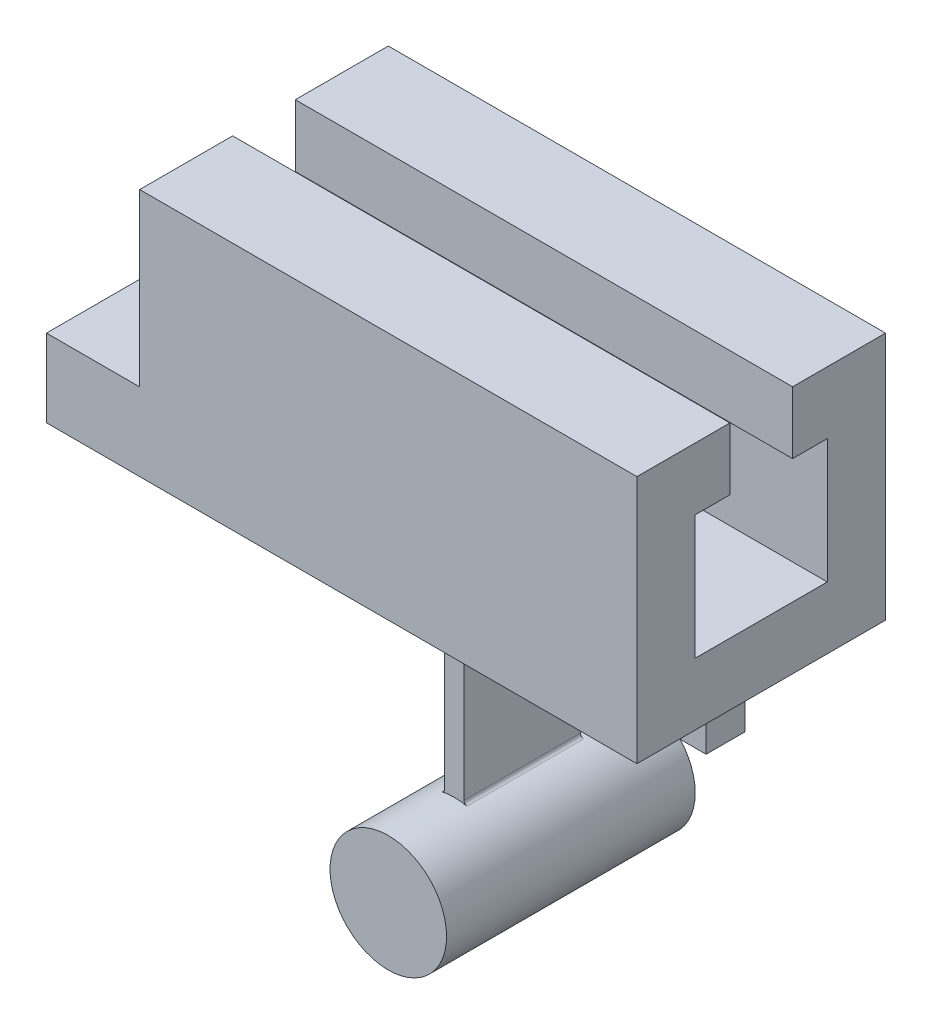
ISO-10303-21;
HEADER;
FILE_DESCRIPTION(('STEP AP214'),'2;1');
FILE_NAME('part.step','',(''),(''),'','','');
FILE_SCHEMA(('AUTOMOTIVE_DESIGN { 1 0 10303 214 1 1 1 1 }'));
ENDSEC;
DATA;
#1=APPLICATION_CONTEXT('core data for automotive mechanical design processes');
#2=APPLICATION_PROTOCOL_DEFINITION('international standard','automotive_design',2000,#1);
#3=PRODUCT_CONTEXT('',#1,'mechanical');
#4=PRODUCT('Part','Part','',(#3));
#5=PRODUCT_RELATED_PRODUCT_CATEGORY('part','',(#4));
#6=PRODUCT_DEFINITION_FORMATION('','',#4);
#7=PRODUCT_DEFINITION_CONTEXT('part definition',#1,'design');
#8=PRODUCT_DEFINITION('design','',#6,#7);
#9=PRODUCT_DEFINITION_SHAPE('','',#8);
#10=(LENGTH_UNIT() NAMED_UNIT(*) SI_UNIT(.MILLI.,.METRE.));
#11=(NAMED_UNIT(*) PLANE_ANGLE_UNIT() SI_UNIT($,.RADIAN.));
#12=(NAMED_UNIT(*) SI_UNIT($,.STERADIAN.) SOLID_ANGLE_UNIT());
#13=UNCERTAINTY_MEASURE_WITH_UNIT(LENGTH_MEASURE(1.E-05),#10,'distance_accuracy_value','');
#14=(GEOMETRIC_REPRESENTATION_CONTEXT(3) GLOBAL_UNCERTAINTY_ASSIGNED_CONTEXT((#13)) GLOBAL_UNIT_ASSIGNED_CONTEXT((#10,
#11,#12)) REPRESENTATION_CONTEXT('',''));
#15=CARTESIAN_POINT('',(0.,0.,0.));
#16=DIRECTION('',(0.,0.,1.));
#17=DIRECTION('',(1.,0.,0.));
#18=AXIS2_PLACEMENT_3D('',#15,#16,#17);
#19=CARTESIAN_POINT('',(50.8,-25.4,25.4));
#20=DIRECTION('',(0.,1.,0.));
#21=DIRECTION('',(0.,0.,1.));
#22=AXIS2_PLACEMENT_3D('',#19,#20,#21);
#23=PLANE('',#22);
#24=DIRECTION('',(0.,0.,1.));
#25=VECTOR('',#24,1.);
#26=CARTESIAN_POINT('',(1.984375,-25.4,11.90625));
#27=LINE('',#26,#25);
#28=CARTESIAN_POINT('',(1.984375,-25.4,-11.90625));
#29=VERTEX_POINT('',#28);
#30=CARTESIAN_POINT('',(1.984375,-25.4,11.90625));
#31=VERTEX_POINT('',#30);
#32=EDGE_CURVE('E468',#29,#31,#27,.T.);
#33=ORIENTED_EDGE('',*,*,#32,.F.);
#34=DIRECTION('',(1.,0.,0.));
#35=VECTOR('',#34,1.);
#36=CARTESIAN_POINT('',(-1.984375,-25.4,-11.90625));
#37=LINE('',#36,#35);
#38=CARTESIAN_POINT('',(-1.984375,-25.4,-11.90625));
#39=VERTEX_POINT('',#38);
#40=EDGE_CURVE('E458',#39,#29,#37,.T.);
#41=ORIENTED_EDGE('',*,*,#40,.F.);
#42=DIRECTION('',(0.,0.,-1.));
#43=VECTOR('',#42,1.);
#44=CARTESIAN_POINT('',(-1.984375,-25.4,11.90625));
#45=LINE('',#44,#43);
#46=CARTESIAN_POINT('',(-1.984375,-25.4,11.90625));
#47=VERTEX_POINT('',#46);
#48=EDGE_CURVE('E465',#47,#39,#45,.T.);
#49=ORIENTED_EDGE('',*,*,#48,.F.);
#50=DIRECTION('',(-1.,0.,0.));
#51=VECTOR('',#50,1.);
#52=CARTESIAN_POINT('',(-1.984375,-25.4,11.90625));
#53=LINE('',#52,#51);
#54=EDGE_CURVE('E467',#31,#47,#53,.T.);
#55=ORIENTED_EDGE('',*,*,#54,.F.);
#56=EDGE_LOOP('',(#33,#41,#49,#55));
#57=FACE_BOUND('',#56,.T.);
#58=DIRECTION('',(-1.,0.,0.));
#59=VECTOR('',#58,1.);
#60=CARTESIAN_POINT('',(50.8,-25.4,25.4));
#61=LINE('',#60,#59);
#62=CARTESIAN_POINT('',(50.8,-25.4,25.4));
#63=VERTEX_POINT('',#62);
#64=CARTESIAN_POINT('',(-69.85,-25.4,25.4));
#65=VERTEX_POINT('',#64);
#66=EDGE_CURVE('E352',#63,#65,#61,.T.);
#67=ORIENTED_EDGE('',*,*,#66,.T.);
#68=DIRECTION('',(0.,0.,1.));
#69=VECTOR('',#68,1.);
#70=CARTESIAN_POINT('',(-69.85,-25.4,-25.4));
#71=LINE('',#70,#69);
#72=CARTESIAN_POINT('',(-69.85,-25.4,-25.4));
#73=VERTEX_POINT('',#72);
#74=EDGE_CURVE('E269',#73,#65,#71,.T.);
#75=ORIENTED_EDGE('',*,*,#74,.F.);
#76=DIRECTION('',(-1.,0.,0.));
#77=VECTOR('',#76,1.);
#78=CARTESIAN_POINT('',(50.8,-25.4,-25.4));
#79=LINE('',#78,#77);
#80=CARTESIAN_POINT('',(50.8,-25.4,-25.4));
#81=VERTEX_POINT('',#80);
#82=EDGE_CURVE('E345',#81,#73,#79,.T.);
#83=ORIENTED_EDGE('',*,*,#82,.F.);
#84=DIRECTION('',(0.,0.,-1.));
#85=VECTOR('',#84,1.);
#86=CARTESIAN_POINT('',(50.8,-25.4,25.4));
#87=LINE('',#86,#85);
#88=EDGE_CURVE('E339',#63,#81,#87,.T.);
#89=ORIENTED_EDGE('',*,*,#88,.F.);
#90=EDGE_LOOP('',(#67,#75,#83,#89));
#91=FACE_BOUND('',#90,.T.);
#92=DIRECTION('',(0.,0.,1.));
#93=VECTOR('',#92,1.);
#94=CARTESIAN_POINT('',(43.49877,-25.4,3.96874999999999));
#95=LINE('',#94,#93);
#96=CARTESIAN_POINT('',(43.49877,-25.4,-3.96875000000001));
#97=VERTEX_POINT('',#96);
#98=CARTESIAN_POINT('',(43.49877,-25.4,3.96875));
#99=VERTEX_POINT('',#98);
#100=EDGE_CURVE('E252',#97,#99,#95,.T.);
#101=ORIENTED_EDGE('',*,*,#100,.F.);
#102=DIRECTION('',(1.,0.,0.));
#103=VECTOR('',#102,1.);
#104=CARTESIAN_POINT('',(35.56127,-25.4,-3.96875000000001));
#105=LINE('',#104,#103);
#106=CARTESIAN_POINT('',(35.56127,-25.4,-3.96875));
#107=VERTEX_POINT('',#106);
#108=EDGE_CURVE('E247',#107,#97,#105,.T.);
#109=ORIENTED_EDGE('',*,*,#108,.F.);
#110=DIRECTION('',(0.,0.,-1.));
#111=VECTOR('',#110,1.);
#112=CARTESIAN_POINT('',(35.56127,-25.4,3.96874999999999));
#113=LINE('',#112,#111);
#114=CARTESIAN_POINT('',(35.56127,-25.4,3.96874999999999));
#115=VERTEX_POINT('',#114);
#116=EDGE_CURVE('E875',#115,#107,#113,.T.);
#117=ORIENTED_EDGE('',*,*,#116,.F.);
#118=DIRECTION('',(-1.,0.,0.));
#119=VECTOR('',#118,1.);
#120=CARTESIAN_POINT('',(35.56127,-25.4,3.96874999999999));
#121=LINE('',#120,#119);
#122=EDGE_CURVE('E885',#99,#115,#121,.T.);
#123=ORIENTED_EDGE('',*,*,#122,.F.);
#124=EDGE_LOOP('',(#101,#109,#117,#123));
#125=FACE_BOUND('',#124,.T.);
#126=ADVANCED_FACE('F55',(#57,#91,#125),#23,.F.);
#127=CARTESIAN_POINT('',(-50.8,0.,0.));
#128=DIRECTION('',(-1.,0.,0.));
#129=DIRECTION('',(0.,0.,1.));
#130=AXIS2_PLACEMENT_3D('',#127,#128,#129);
#131=PLANE('',#130);
#132=DIRECTION('',(0.,0.,-1.));
#133=VECTOR('',#132,1.);
#134=CARTESIAN_POINT('',(-50.8,-9.525,-25.4));
#135=LINE('',#134,#133);
#136=CARTESIAN_POINT('',(-50.8,-9.525,25.4));
#137=VERTEX_POINT('',#136);
#138=CARTESIAN_POINT('',(-50.8,-9.52499999999999,13.49375));
#139=VERTEX_POINT('',#138);
#140=EDGE_CURVE('E257',#137,#139,#135,.T.);
#141=ORIENTED_EDGE('',*,*,#140,.F.);
#142=DIRECTION('',(0.,-1.,0.));
#143=VECTOR('',#142,1.);
#144=CARTESIAN_POINT('',(-50.8,-25.4,25.4));
#145=LINE('',#144,#143);
#146=CARTESIAN_POINT('',(-50.8,25.4,25.4));
#147=VERTEX_POINT('',#146);
#148=EDGE_CURVE('E333',#147,#137,#145,.T.);
#149=ORIENTED_EDGE('',*,*,#148,.F.);
#150=DIRECTION('',(0.,0.,1.));
#151=VECTOR('',#150,1.);
#152=CARTESIAN_POINT('',(-50.8,25.4,25.4));
#153=LINE('',#152,#151);
#154=CARTESIAN_POINT('',(-50.8,25.4,6.4008));
#155=VERTEX_POINT('',#154);
#156=EDGE_CURVE('E344',#155,#147,#153,.T.);
#157=ORIENTED_EDGE('',*,*,#156,.F.);
#158=DIRECTION('',(0.,-1.,0.));
#159=VECTOR('',#158,1.);
#160=CARTESIAN_POINT('',(-50.8,25.4,6.4008));
#161=LINE('',#160,#159);
#162=CARTESIAN_POINT('',(-50.8,12.68476,6.4008));
#163=VERTEX_POINT('',#162);
#164=EDGE_CURVE('E300',#155,#163,#161,.T.);
#165=ORIENTED_EDGE('',*,*,#164,.T.);
#166=DIRECTION('',(0.,0.,-1.));
#167=VECTOR('',#166,1.);
#168=CARTESIAN_POINT('',(-50.8,12.68476,13.49375));
#169=LINE('',#168,#167);
#170=CARTESIAN_POINT('',(-50.8,12.68476,13.49375));
#171=VERTEX_POINT('',#170);
#172=EDGE_CURVE('E416',#171,#163,#169,.T.);
#173=ORIENTED_EDGE('',*,*,#172,.F.);
#174=DIRECTION('',(0.,-1.,0.));
#175=VECTOR('',#174,1.);
#176=CARTESIAN_POINT('',(-50.8,12.68476,13.49375));
#177=LINE('',#176,#175);
#178=EDGE_CURVE('E293',#171,#139,#177,.T.);
#179=ORIENTED_EDGE('',*,*,#178,.T.);
#180=EDGE_LOOP('',(#141,#149,#157,#165,#173,#179));
#181=FACE_BOUND('',#180,.T.);
#182=ADVANCED_FACE('F499',(#181),#131,.T.);
#183=CARTESIAN_POINT('',(1.984375,-75.40625,11.90625));
#184=DIRECTION('',(-1.,0.,0.));
#185=DIRECTION('',(0.,0.,1.));
#186=AXIS2_PLACEMENT_3D('',#183,#184,#185);
#187=PLANE('',#186);
#188=DIRECTION('',(0.,1.,0.));
#189=VECTOR('',#188,1.);
#190=CARTESIAN_POINT('',(1.984375,-75.40625,11.90625));
#191=LINE('',#190,#189);
#192=CARTESIAN_POINT('',(1.984375,-63.0392785671117,11.90625));
#193=VERTEX_POINT('',#192);
#194=EDGE_CURVE('E310',#193,#31,#191,.T.);
#195=ORIENTED_EDGE('',*,*,#194,.F.);
#196=DIRECTION('',(0.,0.,1.));
#197=VECTOR('',#196,1.);
#198=CARTESIAN_POINT('',(1.984375,-63.0392785671117,-11.90625));
#199=LINE('',#198,#197);
#200=CARTESIAN_POINT('',(1.984375,-63.0392785671117,-11.90625));
#201=VERTEX_POINT('',#200);
#202=EDGE_CURVE('E389',#193,#201,#199,.F.);
#203=ORIENTED_EDGE('',*,*,#202,.T.);
#204=DIRECTION('',(0.,1.,0.));
#205=VECTOR('',#204,1.);
#206=CARTESIAN_POINT('',(1.984375,-75.40625,-11.90625));
#207=LINE('',#206,#205);
#208=EDGE_CURVE('E454',#201,#29,#207,.T.);
#209=ORIENTED_EDGE('',*,*,#208,.T.);
#210=ORIENTED_EDGE('',*,*,#32,.T.);
#211=EDGE_LOOP('',(#195,#203,#209,#210));
#212=FACE_BOUND('',#211,.T.);
#213=ADVANCED_FACE('F586',(#212),#187,.F.);
#214=CARTESIAN_POINT('',(-1.984375,-75.40625,11.90625));
#215=DIRECTION('',(1.,0.,0.));
#216=DIRECTION('',(0.,0.,-1.));
#217=AXIS2_PLACEMENT_3D('',#214,#215,#216);
#218=PLANE('',#217);
#219=DIRECTION('',(0.,1.,0.));
#220=VECTOR('',#219,1.);
#221=CARTESIAN_POINT('',(-1.984375,-75.40625,-11.90625));
#222=LINE('',#221,#220);
#223=CARTESIAN_POINT('',(-1.984375,-63.0392785671117,-11.90625));
#224=VERTEX_POINT('',#223);
#225=EDGE_CURVE('E455',#224,#39,#222,.T.);
#226=ORIENTED_EDGE('',*,*,#225,.F.);
#227=DIRECTION('',(0.,0.,1.));
#228=VECTOR('',#227,1.);
#229=CARTESIAN_POINT('',(-1.984375,-63.0392785671117,11.90625));
#230=LINE('',#229,#228);
#231=CARTESIAN_POINT('',(-1.984375,-63.0392785671117,11.90625));
#232=VERTEX_POINT('',#231);
#233=EDGE_CURVE('E74',#224,#232,#230,.T.);
#234=ORIENTED_EDGE('',*,*,#233,.T.);
#235=DIRECTION('',(0.,1.,0.));
#236=VECTOR('',#235,1.);
#237=CARTESIAN_POINT('',(-1.984375,-75.40625,11.90625));
#238=LINE('',#237,#236);
#239=EDGE_CURVE('E446',#232,#47,#238,.T.);
#240=ORIENTED_EDGE('',*,*,#239,.T.);
#241=ORIENTED_EDGE('',*,*,#48,.T.);
#242=EDGE_LOOP('',(#226,#234,#240,#241));
#243=FACE_BOUND('',#242,.T.);
#244=ADVANCED_FACE('F640',(#243),#218,.F.);
#245=CARTESIAN_POINT('',(50.8,25.4,25.4));
#246=DIRECTION('',(0.,-1.,0.));
#247=DIRECTION('',(0.,0.,-1.));
#248=AXIS2_PLACEMENT_3D('',#245,#246,#247);
#249=PLANE('',#248);
#250=DIRECTION('',(1.,0.,0.));
#251=VECTOR('',#250,1.);
#252=CARTESIAN_POINT('',(-50.8,25.4,-6.4008));
#253=LINE('',#252,#251);
#254=CARTESIAN_POINT('',(-50.8,25.4,-6.4008));
#255=VERTEX_POINT('',#254);
#256=CARTESIAN_POINT('',(50.8,25.4,-6.4008));
#257=VERTEX_POINT('',#256);
#258=EDGE_CURVE('E305',#255,#257,#253,.T.);
#259=ORIENTED_EDGE('',*,*,#258,.T.);
#260=DIRECTION('',(0.,0.,1.));
#261=VECTOR('',#260,1.);
#262=CARTESIAN_POINT('',(50.8,25.4,25.4));
#263=LINE('',#262,#261);
#264=CARTESIAN_POINT('',(50.8,25.4,-25.4));
#265=VERTEX_POINT('',#264);
#266=EDGE_CURVE('E335',#265,#257,#263,.T.);
#267=ORIENTED_EDGE('',*,*,#266,.F.);
#268=DIRECTION('',(-1.,0.,0.));
#269=VECTOR('',#268,1.);
#270=CARTESIAN_POINT('',(50.8,25.4,-25.4));
#271=LINE('',#270,#269);
#272=CARTESIAN_POINT('',(-50.8,25.4,-25.4));
#273=VERTEX_POINT('',#272);
#274=EDGE_CURVE('E365',#265,#273,#271,.T.);
#275=ORIENTED_EDGE('',*,*,#274,.T.);
#276=EDGE_CURVE('E346',#273,#255,#153,.T.);
#277=ORIENTED_EDGE('',*,*,#276,.T.);
#278=EDGE_LOOP('',(#259,#267,#275,#277));
#279=FACE_BOUND('',#278,.T.);
#280=ADVANCED_FACE('F564',(#279),#249,.F.);
#281=CARTESIAN_POINT('',(50.8,0.,0.));
#282=DIRECTION('',(-1.,0.,0.));
#283=DIRECTION('',(0.,0.,1.));
#284=AXIS2_PLACEMENT_3D('',#281,#282,#283);
#285=PLANE('',#284);
#286=DIRECTION('',(0.,-1.,0.));
#287=VECTOR('',#286,1.);
#288=CARTESIAN_POINT('',(50.8,25.4,-6.4008));
#289=LINE('',#288,#287);
#290=CARTESIAN_POINT('',(50.8,12.68476,-6.4008));
#291=VERTEX_POINT('',#290);
#292=EDGE_CURVE('E303',#257,#291,#289,.T.);
#293=ORIENTED_EDGE('',*,*,#292,.T.);
#294=DIRECTION('',(0.,0.,-1.));
#295=VECTOR('',#294,1.);
#296=CARTESIAN_POINT('',(50.8,12.68476,13.49375));
#297=LINE('',#296,#295);
#298=CARTESIAN_POINT('',(50.8,12.68476,-13.49375));
#299=VERTEX_POINT('',#298);
#300=EDGE_CURVE('E440',#291,#299,#297,.T.);
#301=ORIENTED_EDGE('',*,*,#300,.T.);
#302=DIRECTION('',(0.,-1.,0.));
#303=VECTOR('',#302,1.);
#304=CARTESIAN_POINT('',(50.8,12.68476,-13.49375));
#305=LINE('',#304,#303);
#306=CARTESIAN_POINT('',(50.8,-12.68476,-13.49375));
#307=VERTEX_POINT('',#306);
#308=EDGE_CURVE('E441',#299,#307,#305,.T.);
#309=ORIENTED_EDGE('',*,*,#308,.T.);
#310=DIRECTION('',(0.,0.,-1.));
#311=VECTOR('',#310,1.);
#312=CARTESIAN_POINT('',(50.8,-12.68476,13.49375));
#313=LINE('',#312,#311);
#314=CARTESIAN_POINT('',(50.8,-12.68476,13.49375));
#315=VERTEX_POINT('',#314);
#316=EDGE_CURVE('E316',#315,#307,#313,.T.);
#317=ORIENTED_EDGE('',*,*,#316,.F.);
#318=DIRECTION('',(0.,-1.,0.));
#319=VECTOR('',#318,1.);
#320=CARTESIAN_POINT('',(50.8,12.68476,13.49375));
#321=LINE('',#320,#319);
#322=CARTESIAN_POINT('',(50.8,12.68476,13.49375));
#323=VERTEX_POINT('',#322);
#324=EDGE_CURVE('E427',#323,#315,#321,.T.);
#325=ORIENTED_EDGE('',*,*,#324,.F.);
#326=CARTESIAN_POINT('',(50.8,12.68476,6.4008));
#327=VERTEX_POINT('',#326);
#328=EDGE_CURVE('E433',#323,#327,#297,.T.);
#329=ORIENTED_EDGE('',*,*,#328,.T.);
#330=DIRECTION('',(0.,-1.,0.));
#331=VECTOR('',#330,1.);
#332=CARTESIAN_POINT('',(50.8,25.4,6.4008));
#333=LINE('',#332,#331);
#334=CARTESIAN_POINT('',(50.8,25.4,6.4008));
#335=VERTEX_POINT('',#334);
#336=EDGE_CURVE('E296',#335,#327,#333,.T.);
#337=ORIENTED_EDGE('',*,*,#336,.F.);
#338=CARTESIAN_POINT('',(50.8,25.4,25.4));
#339=VERTEX_POINT('',#338);
#340=EDGE_CURVE('E329',#335,#339,#263,.T.);
#341=ORIENTED_EDGE('',*,*,#340,.T.);
#342=DIRECTION('',(0.,-1.,0.));
#343=VECTOR('',#342,1.);
#344=CARTESIAN_POINT('',(50.8,-25.4,25.4));
#345=LINE('',#344,#343);
#346=EDGE_CURVE('E337',#339,#63,#345,.T.);
#347=ORIENTED_EDGE('',*,*,#346,.T.);
#348=ORIENTED_EDGE('',*,*,#88,.T.);
#349=DIRECTION('',(0.,1.,0.));
#350=VECTOR('',#349,1.);
#351=CARTESIAN_POINT('',(50.8,-25.4,-25.4));
#352=LINE('',#351,#350);
#353=EDGE_CURVE('E326',#81,#265,#352,.T.);
#354=ORIENTED_EDGE('',*,*,#353,.T.);
#355=ORIENTED_EDGE('',*,*,#266,.T.);
#356=EDGE_LOOP('',(#293,#301,#309,#317,#325,#329,#337,#341,#347,#348,#354,#355));
#357=FACE_BOUND('',#356,.T.);
#358=ADVANCED_FACE('F541',(#357),#285,.F.);
#359=CARTESIAN_POINT('',(-50.8,-9.52499999999999,-13.49375));
#360=VERTEX_POINT('',#359);
#361=CARTESIAN_POINT('',(-50.8,-9.525,-25.4));
#362=VERTEX_POINT('',#361);
#363=EDGE_CURVE('E259',#360,#362,#135,.T.);
#364=ORIENTED_EDGE('',*,*,#363,.F.);
#365=DIRECTION('',(0.,-1.,0.));
#366=VECTOR('',#365,1.);
#367=CARTESIAN_POINT('',(-50.8,12.68476,-13.49375));
#368=LINE('',#367,#366);
#369=CARTESIAN_POINT('',(-50.8,12.68476,-13.49375));
#370=VERTEX_POINT('',#369);
#371=EDGE_CURVE('E421',#370,#360,#368,.T.);
#372=ORIENTED_EDGE('',*,*,#371,.F.);
#373=CARTESIAN_POINT('',(-50.8,12.68476,-6.4008));
#374=VERTEX_POINT('',#373);
#375=EDGE_CURVE('E417',#374,#370,#169,.T.);
#376=ORIENTED_EDGE('',*,*,#375,.F.);
#377=DIRECTION('',(0.,-1.,0.));
#378=VECTOR('',#377,1.);
#379=CARTESIAN_POINT('',(-50.8,25.4,-6.4008));
#380=LINE('',#379,#378);
#381=EDGE_CURVE('E291',#255,#374,#380,.T.);
#382=ORIENTED_EDGE('',*,*,#381,.F.);
#383=ORIENTED_EDGE('',*,*,#276,.F.);
#384=DIRECTION('',(0.,1.,0.));
#385=VECTOR('',#384,1.);
#386=CARTESIAN_POINT('',(-50.8,-25.4,-25.4));
#387=LINE('',#386,#385);
#388=EDGE_CURVE('E313',#362,#273,#387,.T.);
#389=ORIENTED_EDGE('',*,*,#388,.F.);
#390=EDGE_LOOP('',(#364,#372,#376,#382,#383,#389));
#391=FACE_BOUND('',#390,.T.);
#392=ADVANCED_FACE('F546',(#391),#131,.T.);
#393=CARTESIAN_POINT('',(50.8,-25.4,-25.4));
#394=DIRECTION('',(0.,0.,1.));
#395=DIRECTION('',(1.,0.,0.));
#396=AXIS2_PLACEMENT_3D('',#393,#394,#395);
#397=PLANE('',#396);
#398=ORIENTED_EDGE('',*,*,#82,.T.);
#399=DIRECTION('',(0.,-1.,0.));
#400=VECTOR('',#399,1.);
#401=CARTESIAN_POINT('',(-69.85,-25.4,-25.4));
#402=LINE('',#401,#400);
#403=CARTESIAN_POINT('',(-69.85,-9.525,-25.4));
#404=VERTEX_POINT('',#403);
#405=EDGE_CURVE('E264',#404,#73,#402,.T.);
#406=ORIENTED_EDGE('',*,*,#405,.F.);
#407=DIRECTION('',(1.,0.,0.));
#408=VECTOR('',#407,1.);
#409=CARTESIAN_POINT('',(-69.85,-9.525,-25.4));
#410=LINE('',#409,#408);
#411=EDGE_CURVE('E278',#404,#362,#410,.T.);
#412=ORIENTED_EDGE('',*,*,#411,.T.);
#413=ORIENTED_EDGE('',*,*,#388,.T.);
#414=ORIENTED_EDGE('',*,*,#274,.F.);
#415=ORIENTED_EDGE('',*,*,#353,.F.);
#416=EDGE_LOOP('',(#398,#406,#412,#413,#414,#415));
#417=FACE_BOUND('',#416,.T.);
#418=ADVANCED_FACE('F555',(#417),#397,.F.);
#419=ORIENTED_EDGE('',*,*,#340,.F.);
#420=DIRECTION('',(1.,0.,0.));
#421=VECTOR('',#420,1.);
#422=CARTESIAN_POINT('',(-50.8,25.4,6.4008));
#423=LINE('',#422,#421);
#424=EDGE_CURVE('E317',#155,#335,#423,.T.);
#425=ORIENTED_EDGE('',*,*,#424,.F.);
#426=ORIENTED_EDGE('',*,*,#156,.T.);
#427=DIRECTION('',(-1.,0.,0.));
#428=VECTOR('',#427,1.);
#429=CARTESIAN_POINT('',(50.8,25.4,25.4));
#430=LINE('',#429,#428);
#431=EDGE_CURVE('E356',#339,#147,#430,.T.);
#432=ORIENTED_EDGE('',*,*,#431,.F.);
#433=EDGE_LOOP('',(#419,#425,#426,#432));
#434=FACE_BOUND('',#433,.T.);
#435=ADVANCED_FACE('F515',(#434),#249,.F.);
#436=CARTESIAN_POINT('',(50.8,-25.4,25.4));
#437=DIRECTION('',(0.,0.,-1.));
#438=DIRECTION('',(-1.,0.,0.));
#439=AXIS2_PLACEMENT_3D('',#436,#437,#438);
#440=PLANE('',#439);
#441=ORIENTED_EDGE('',*,*,#148,.T.);
#442=DIRECTION('',(1.,0.,0.));
#443=VECTOR('',#442,1.);
#444=CARTESIAN_POINT('',(-69.85,-9.525,25.4));
#445=LINE('',#444,#443);
#446=CARTESIAN_POINT('',(-69.85,-9.525,25.4));
#447=VERTEX_POINT('',#446);
#448=EDGE_CURVE('E482',#447,#137,#445,.T.);
#449=ORIENTED_EDGE('',*,*,#448,.F.);
#450=DIRECTION('',(0.,1.,0.));
#451=VECTOR('',#450,1.);
#452=CARTESIAN_POINT('',(-69.85,-25.4,25.4));
#453=LINE('',#452,#451);
#454=EDGE_CURVE('E271',#65,#447,#453,.T.);
#455=ORIENTED_EDGE('',*,*,#454,.F.);
#456=ORIENTED_EDGE('',*,*,#66,.F.);
#457=ORIENTED_EDGE('',*,*,#346,.F.);
#458=ORIENTED_EDGE('',*,*,#431,.T.);
#459=EDGE_LOOP('',(#441,#449,#455,#456,#457,#458));
#460=FACE_BOUND('',#459,.T.);
#461=ADVANCED_FACE('F504',(#460),#440,.F.);
#462=CARTESIAN_POINT('',(-50.8,-12.68476,13.49375));
#463=DIRECTION('',(0.,-1.,0.));
#464=DIRECTION('',(0.,0.,-1.));
#465=AXIS2_PLACEMENT_3D('',#462,#463,#464);
#466=PLANE('',#465);
#467=DIRECTION('',(1.,0.,0.));
#468=VECTOR('',#467,1.);
#469=CARTESIAN_POINT('',(-50.8,-12.68476,-13.49375));
#470=LINE('',#469,#468);
#471=CARTESIAN_POINT('',(-50.038,-12.68476,-13.49375));
#472=VERTEX_POINT('',#471);
#473=EDGE_CURVE('E284',#472,#307,#470,.T.);
#474=ORIENTED_EDGE('',*,*,#473,.F.);
#475=DIRECTION('',(0.,0.,-1.));
#476=VECTOR('',#475,1.);
#477=CARTESIAN_POINT('',(-50.038,-12.68476,13.49375));
#478=LINE('',#477,#476);
#479=CARTESIAN_POINT('',(-50.038,-12.68476,13.49375));
#480=VERTEX_POINT('',#479);
#481=EDGE_CURVE('E376',#472,#480,#478,.F.);
#482=ORIENTED_EDGE('',*,*,#481,.T.);
#483=DIRECTION('',(1.,0.,0.));
#484=VECTOR('',#483,1.);
#485=CARTESIAN_POINT('',(-50.8,-12.68476,13.49375));
#486=LINE('',#485,#484);
#487=EDGE_CURVE('E324',#480,#315,#486,.T.);
#488=ORIENTED_EDGE('',*,*,#487,.T.);
#489=ORIENTED_EDGE('',*,*,#316,.T.);
#490=EDGE_LOOP('',(#474,#482,#488,#489));
#491=FACE_BOUND('',#490,.T.);
#492=ADVANCED_FACE('F537',(#491),#466,.F.);
#493=CARTESIAN_POINT('',(-50.8,12.68476,13.49375));
#494=DIRECTION('',(0.,0.,1.));
#495=DIRECTION('',(1.,0.,0.));
#496=AXIS2_PLACEMENT_3D('',#493,#494,#495);
#497=PLANE('',#496);
#498=ORIENTED_EDGE('',*,*,#487,.F.);
#499=CARTESIAN_POINT('',(-50.038,-11.92276,13.49375));
#500=DIRECTION('',(0.,0.,1.));
#501=DIRECTION('',(1.,0.,0.));
#502=AXIS2_PLACEMENT_3D('',#499,#500,#501);
#503=CIRCLE('',#502,0.762);
#504=CARTESIAN_POINT('',(-50.8,-11.92276,13.49375));
#505=VERTEX_POINT('',#504);
#506=EDGE_CURVE('E378',#480,#505,#503,.F.);
#507=ORIENTED_EDGE('',*,*,#506,.T.);
#508=EDGE_CURVE('E412',#139,#505,#177,.T.);
#509=ORIENTED_EDGE('',*,*,#508,.F.);
#510=ORIENTED_EDGE('',*,*,#178,.F.);
#511=DIRECTION('',(1.,0.,0.));
#512=VECTOR('',#511,1.);
#513=CARTESIAN_POINT('',(-50.8,12.68476,13.49375));
#514=LINE('',#513,#512);
#515=EDGE_CURVE('E407',#171,#323,#514,.T.);
#516=ORIENTED_EDGE('',*,*,#515,.T.);
#517=ORIENTED_EDGE('',*,*,#324,.T.);
#518=EDGE_LOOP('',(#498,#507,#509,#510,#516,#517));
#519=FACE_BOUND('',#518,.T.);
#520=ADVANCED_FACE('F522',(#519),#497,.F.);
#521=CARTESIAN_POINT('',(-50.8,12.68476,-13.49375));
#522=DIRECTION('',(0.,0.,1.));
#523=DIRECTION('',(1.,0.,0.));
#524=AXIS2_PLACEMENT_3D('',#521,#522,#523);
#525=PLANE('',#524);
#526=CARTESIAN_POINT('',(-50.8,-11.92276,-13.49375));
#527=VERTEX_POINT('',#526);
#528=EDGE_CURVE('E428',#360,#527,#368,.T.);
#529=ORIENTED_EDGE('',*,*,#528,.T.);
#530=CARTESIAN_POINT('',(-50.038,-11.92276,-13.49375));
#531=DIRECTION('',(0.,0.,1.));
#532=DIRECTION('',(1.,0.,0.));
#533=AXIS2_PLACEMENT_3D('',#530,#531,#532);
#534=CIRCLE('',#533,0.762);
#535=EDGE_CURVE('E373',#527,#472,#534,.T.);
#536=ORIENTED_EDGE('',*,*,#535,.T.);
#537=ORIENTED_EDGE('',*,*,#473,.T.);
#538=ORIENTED_EDGE('',*,*,#308,.F.);
#539=DIRECTION('',(1.,0.,0.));
#540=VECTOR('',#539,1.);
#541=CARTESIAN_POINT('',(-50.8,12.68476,-13.49375));
#542=LINE('',#541,#540);
#543=EDGE_CURVE('E287',#370,#299,#542,.T.);
#544=ORIENTED_EDGE('',*,*,#543,.F.);
#545=ORIENTED_EDGE('',*,*,#371,.T.);
#546=EDGE_LOOP('',(#529,#536,#537,#538,#544,#545));
#547=FACE_BOUND('',#546,.T.);
#548=ADVANCED_FACE('F533',(#547),#525,.T.);
#549=CARTESIAN_POINT('',(-50.8,12.68476,13.49375));
#550=DIRECTION('',(0.,-1.,0.));
#551=DIRECTION('',(0.,0.,-1.));
#552=AXIS2_PLACEMENT_3D('',#549,#550,#551);
#553=PLANE('',#552);
#554=ORIENTED_EDGE('',*,*,#375,.T.);
#555=ORIENTED_EDGE('',*,*,#543,.T.);
#556=ORIENTED_EDGE('',*,*,#300,.F.);
#557=DIRECTION('',(1.,0.,0.));
#558=VECTOR('',#557,1.);
#559=CARTESIAN_POINT('',(-50.8,12.68476,-6.4008));
#560=LINE('',#559,#558);
#561=EDGE_CURVE('E314',#374,#291,#560,.T.);
#562=ORIENTED_EDGE('',*,*,#561,.F.);
#563=EDGE_LOOP('',(#554,#555,#556,#562));
#564=FACE_BOUND('',#563,.T.);
#565=ADVANCED_FACE('F568',(#564),#553,.T.);
#566=DIRECTION('',(1.,0.,0.));
#567=VECTOR('',#566,1.);
#568=CARTESIAN_POINT('',(-50.8,12.68476,6.4008));
#569=LINE('',#568,#567);
#570=EDGE_CURVE('E311',#163,#327,#569,.T.);
#571=ORIENTED_EDGE('',*,*,#570,.T.);
#572=ORIENTED_EDGE('',*,*,#328,.F.);
#573=ORIENTED_EDGE('',*,*,#515,.F.);
#574=ORIENTED_EDGE('',*,*,#172,.T.);
#575=EDGE_LOOP('',(#571,#572,#573,#574));
#576=FACE_BOUND('',#575,.T.);
#577=ADVANCED_FACE('F519',(#576),#553,.T.);
#578=CARTESIAN_POINT('',(-50.8,25.4,-6.4008));
#579=DIRECTION('',(0.,0.,1.));
#580=DIRECTION('',(0.,-1.,0.));
#581=AXIS2_PLACEMENT_3D('',#578,#579,#580);
#582=PLANE('',#581);
#583=ORIENTED_EDGE('',*,*,#292,.F.);
#584=ORIENTED_EDGE('',*,*,#258,.F.);
#585=ORIENTED_EDGE('',*,*,#381,.T.);
#586=ORIENTED_EDGE('',*,*,#561,.T.);
#587=EDGE_LOOP('',(#583,#584,#585,#586));
#588=FACE_BOUND('',#587,.T.);
#589=ADVANCED_FACE('F570',(#588),#582,.T.);
#590=CARTESIAN_POINT('',(-50.8,25.4,6.4008));
#591=DIRECTION('',(0.,0.,1.));
#592=DIRECTION('',(0.,-1.,0.));
#593=AXIS2_PLACEMENT_3D('',#590,#591,#592);
#594=PLANE('',#593);
#595=ORIENTED_EDGE('',*,*,#336,.T.);
#596=ORIENTED_EDGE('',*,*,#570,.F.);
#597=ORIENTED_EDGE('',*,*,#164,.F.);
#598=ORIENTED_EDGE('',*,*,#424,.T.);
#599=EDGE_LOOP('',(#595,#596,#597,#598));
#600=FACE_BOUND('',#599,.T.);
#601=ADVANCED_FACE('F516',(#600),#594,.F.);
#602=CARTESIAN_POINT('',(-1.984375,-75.40625,11.90625));
#603=DIRECTION('',(0.,0.,-1.));
#604=DIRECTION('',(-1.,0.,0.));
#605=AXIS2_PLACEMENT_3D('',#602,#603,#604);
#606=PLANE('',#605);
#607=CARTESIAN_POINT('',(0.,-75.40625,11.90625));
#608=DIRECTION('',(0.,0.,-1.));
#609=DIRECTION('',(-1.,0.,0.));
#610=AXIS2_PLACEMENT_3D('',#607,#608,#609);
#611=CIRCLE('',#610,11.90625);
#612=CARTESIAN_POINT('',(2.58117951127819,-63.7831565480373,11.90625));
#613=VERTEX_POINT('',#612);
#614=CARTESIAN_POINT('',(-2.5811795112782,-63.7831565480373,11.90625));
#615=VERTEX_POINT('',#614);
#616=EDGE_CURVE('E473',#613,#615,#611,.F.);
#617=ORIENTED_EDGE('',*,*,#616,.F.);
#618=CARTESIAN_POINT('',(2.746375,-63.0392785671117,11.90625));
#619=DIRECTION('',(0.,0.,-1.));
#620=DIRECTION('',(-1.,0.,0.));
#621=AXIS2_PLACEMENT_3D('',#618,#619,#620);
#622=CIRCLE('',#621,0.762);
#623=EDGE_CURVE('E394',#613,#193,#622,.T.);
#624=ORIENTED_EDGE('',*,*,#623,.T.);
#625=ORIENTED_EDGE('',*,*,#194,.T.);
#626=ORIENTED_EDGE('',*,*,#54,.T.);
#627=ORIENTED_EDGE('',*,*,#239,.F.);
#628=CARTESIAN_POINT('',(-2.746375,-63.0392785671117,11.90625));
#629=DIRECTION('',(0.,0.,-1.));
#630=DIRECTION('',(-1.,0.,0.));
#631=AXIS2_PLACEMENT_3D('',#628,#629,#630);
#632=CIRCLE('',#631,0.762);
#633=EDGE_CURVE('E12',#232,#615,#632,.T.);
#634=ORIENTED_EDGE('',*,*,#633,.T.);
#635=EDGE_LOOP('',(#617,#624,#625,#626,#627,#634));
#636=FACE_BOUND('',#635,.T.);
#637=ADVANCED_FACE('F617',(#636),#606,.F.);
#638=CARTESIAN_POINT('',(-1.984375,-75.40625,-11.90625));
#639=DIRECTION('',(0.,0.,1.));
#640=DIRECTION('',(1.,0.,0.));
#641=AXIS2_PLACEMENT_3D('',#638,#639,#640);
#642=PLANE('',#641);
#643=CARTESIAN_POINT('',(0.,-75.40625,-11.90625));
#644=DIRECTION('',(0.,0.,1.));
#645=DIRECTION('',(1.,0.,0.));
#646=AXIS2_PLACEMENT_3D('',#643,#644,#645);
#647=CIRCLE('',#646,11.90625);
#648=CARTESIAN_POINT('',(-2.5811795112782,-63.7831565480373,-11.90625));
#649=VERTEX_POINT('',#648);
#650=CARTESIAN_POINT('',(2.58117951127819,-63.7831565480373,-11.90625));
#651=VERTEX_POINT('',#650);
#652=EDGE_CURVE('E366',#649,#651,#647,.F.);
#653=ORIENTED_EDGE('',*,*,#652,.F.);
#654=CARTESIAN_POINT('',(-2.746375,-63.0392785671117,-11.90625));
#655=DIRECTION('',(0.,0.,1.));
#656=DIRECTION('',(1.,0.,0.));
#657=AXIS2_PLACEMENT_3D('',#654,#655,#656);
#658=CIRCLE('',#657,0.762);
#659=EDGE_CURVE('E61',#649,#224,#658,.T.);
#660=ORIENTED_EDGE('',*,*,#659,.T.);
#661=ORIENTED_EDGE('',*,*,#225,.T.);
#662=ORIENTED_EDGE('',*,*,#40,.T.);
#663=ORIENTED_EDGE('',*,*,#208,.F.);
#664=CARTESIAN_POINT('',(2.746375,-63.0392785671117,-11.90625));
#665=DIRECTION('',(0.,0.,1.));
#666=DIRECTION('',(1.,0.,0.));
#667=AXIS2_PLACEMENT_3D('',#664,#665,#666);
#668=CIRCLE('',#667,0.762);
#669=EDGE_CURVE('E396',#201,#651,#668,.T.);
#670=ORIENTED_EDGE('',*,*,#669,.T.);
#671=EDGE_LOOP('',(#653,#660,#661,#662,#663,#670));
#672=FACE_BOUND('',#671,.T.);
#673=ADVANCED_FACE('F609',(#672),#642,.F.);
#674=CARTESIAN_POINT('',(0.,-75.40625,25.4));
#675=DIRECTION('',(0.,0.,-1.));
#676=DIRECTION('',(-1.,0.,0.));
#677=AXIS2_PLACEMENT_3D('',#674,#675,#676);
#678=CYLINDRICAL_SURFACE('',#677,11.90625);
#679=CARTESIAN_POINT('',(0.,-75.40625,25.4));
#680=DIRECTION('',(0.,0.,1.));
#681=DIRECTION('',(1.,0.,0.));
#682=AXIS2_PLACEMENT_3D('',#679,#680,#681);
#683=CIRCLE('',#682,11.90625);
#684=CARTESIAN_POINT('',(11.90625,-75.40625,25.4));
#685=VERTEX_POINT('',#684);
#686=EDGE_CURVE('E480',#685,#685,#683,.T.);
#687=ORIENTED_EDGE('',*,*,#686,.F.);
#688=EDGE_LOOP('',(#687));
#689=FACE_BOUND('',#688,.T.);
#690=CARTESIAN_POINT('',(0.,-75.40625,-25.4));
#691=DIRECTION('',(0.,0.,1.));
#692=DIRECTION('',(1.,0.,0.));
#693=AXIS2_PLACEMENT_3D('',#690,#691,#692);
#694=CIRCLE('',#693,11.90625);
#695=CARTESIAN_POINT('',(11.90625,-75.40625,-25.4));
#696=VERTEX_POINT('',#695);
#697=EDGE_CURVE('E483',#696,#696,#694,.T.);
#698=ORIENTED_EDGE('',*,*,#697,.T.);
#699=EDGE_LOOP('',(#698));
#700=FACE_BOUND('',#699,.T.);
#701=DIRECTION('',(0.,0.,-1.));
#702=VECTOR('',#701,1.);
#703=CARTESIAN_POINT('',(2.58117951127819,-63.7831565480373,25.4));
#704=LINE('',#703,#702);
#705=EDGE_CURVE('E386',#651,#613,#704,.F.);
#706=ORIENTED_EDGE('',*,*,#705,.T.);
#707=ORIENTED_EDGE('',*,*,#616,.T.);
#708=DIRECTION('',(0.,0.,-1.));
#709=VECTOR('',#708,1.);
#710=CARTESIAN_POINT('',(-2.5811795112782,-63.7831565480373,25.4));
#711=LINE('',#710,#709);
#712=EDGE_CURVE('E382',#615,#649,#711,.T.);
#713=ORIENTED_EDGE('',*,*,#712,.T.);
#714=ORIENTED_EDGE('',*,*,#652,.T.);
#715=EDGE_LOOP('',(#706,#707,#713,#714));
#716=FACE_BOUND('',#715,.T.);
#717=ADVANCED_FACE('F619',(#689,#700,#716),#678,.T.);
#718=CARTESIAN_POINT('',(0.,-75.40625,25.4));
#719=DIRECTION('',(0.,0.,1.));
#720=DIRECTION('',(1.,0.,0.));
#721=AXIS2_PLACEMENT_3D('',#718,#719,#720);
#722=PLANE('',#721);
#723=ORIENTED_EDGE('',*,*,#686,.T.);
#724=EDGE_LOOP('',(#723));
#725=FACE_BOUND('',#724,.T.);
#726=ADVANCED_FACE('F621',(#725),#722,.T.);
#727=CARTESIAN_POINT('',(0.,-75.40625,-25.4));
#728=DIRECTION('',(0.,0.,1.));
#729=DIRECTION('',(1.,0.,0.));
#730=AXIS2_PLACEMENT_3D('',#727,#728,#729);
#731=PLANE('',#730);
#732=ORIENTED_EDGE('',*,*,#697,.F.);
#733=EDGE_LOOP('',(#732));
#734=FACE_BOUND('',#733,.T.);
#735=ADVANCED_FACE('F628',(#734),#731,.F.);
#736=CARTESIAN_POINT('',(-69.85,-9.525,-25.4));
#737=DIRECTION('',(0.,-1.,0.));
#738=DIRECTION('',(0.,0.,-1.));
#739=AXIS2_PLACEMENT_3D('',#736,#737,#738);
#740=PLANE('',#739);
#741=ORIENTED_EDGE('',*,*,#140,.T.);
#742=EDGE_CURVE('E254',#139,#360,#135,.T.);
#743=ORIENTED_EDGE('',*,*,#742,.T.);
#744=ORIENTED_EDGE('',*,*,#363,.T.);
#745=ORIENTED_EDGE('',*,*,#411,.F.);
#746=DIRECTION('',(0.,0.,-1.));
#747=VECTOR('',#746,1.);
#748=CARTESIAN_POINT('',(-69.85,-9.525,-25.4));
#749=LINE('',#748,#747);
#750=EDGE_CURVE('E276',#447,#404,#749,.T.);
#751=ORIENTED_EDGE('',*,*,#750,.F.);
#752=ORIENTED_EDGE('',*,*,#448,.T.);
#753=EDGE_LOOP('',(#741,#743,#744,#745,#751,#752));
#754=FACE_BOUND('',#753,.T.);
#755=ADVANCED_FACE('F494',(#754),#740,.F.);
#756=CARTESIAN_POINT('',(-69.85,0.,0.));
#757=DIRECTION('',(1.,0.,0.));
#758=DIRECTION('',(0.,0.,-1.));
#759=AXIS2_PLACEMENT_3D('',#756,#757,#758);
#760=PLANE('',#759);
#761=ORIENTED_EDGE('',*,*,#405,.T.);
#762=ORIENTED_EDGE('',*,*,#74,.T.);
#763=ORIENTED_EDGE('',*,*,#454,.T.);
#764=ORIENTED_EDGE('',*,*,#750,.T.);
#765=EDGE_LOOP('',(#761,#762,#763,#764));
#766=FACE_BOUND('',#765,.T.);
#767=ADVANCED_FACE('F557',(#766),#760,.F.);
#768=CARTESIAN_POINT('',(-50.8,0.,0.));
#769=DIRECTION('',(1.,0.,0.));
#770=DIRECTION('',(0.,0.,-1.));
#771=AXIS2_PLACEMENT_3D('',#768,#769,#770);
#772=PLANE('',#771);
#773=ORIENTED_EDGE('',*,*,#508,.T.);
#774=DIRECTION('',(0.,0.,-1.));
#775=VECTOR('',#774,1.);
#776=CARTESIAN_POINT('',(-50.8,-11.92276,0.));
#777=LINE('',#776,#775);
#778=EDGE_CURVE('E367',#505,#527,#777,.T.);
#779=ORIENTED_EDGE('',*,*,#778,.T.);
#780=ORIENTED_EDGE('',*,*,#528,.F.);
#781=ORIENTED_EDGE('',*,*,#742,.F.);
#782=EDGE_LOOP('',(#773,#779,#780,#781));
#783=FACE_BOUND('',#782,.T.);
#784=ADVANCED_FACE('F526',(#783),#772,.T.);
#785=CARTESIAN_POINT('',(43.49877,-38.1,3.96874999999999));
#786=DIRECTION('',(-1.,0.,0.));
#787=DIRECTION('',(0.,0.,1.));
#788=AXIS2_PLACEMENT_3D('',#785,#786,#787);
#789=PLANE('',#788);
#790=ORIENTED_EDGE('',*,*,#100,.T.);
#791=DIRECTION('',(0.,1.,0.));
#792=VECTOR('',#791,1.);
#793=CARTESIAN_POINT('',(43.49877,-38.1,3.96874999999999));
#794=LINE('',#793,#792);
#795=CARTESIAN_POINT('',(43.49877,-38.1,3.96874999999999));
#796=VERTEX_POINT('',#795);
#797=EDGE_CURVE('E229',#796,#99,#794,.T.);
#798=ORIENTED_EDGE('',*,*,#797,.F.);
#799=DIRECTION('',(0.,0.,1.));
#800=VECTOR('',#799,1.);
#801=CARTESIAN_POINT('',(43.49877,-38.1,3.96874999999999));
#802=LINE('',#801,#800);
#803=CARTESIAN_POINT('',(43.49877,-38.1,-3.96875000000001));
#804=VERTEX_POINT('',#803);
#805=EDGE_CURVE('E238',#804,#796,#802,.T.);
#806=ORIENTED_EDGE('',*,*,#805,.F.);
#807=DIRECTION('',(0.,1.,0.));
#808=VECTOR('',#807,1.);
#809=CARTESIAN_POINT('',(43.49877,-38.1,-3.96875000000001));
#810=LINE('',#809,#808);
#811=EDGE_CURVE('E868',#804,#97,#810,.T.);
#812=ORIENTED_EDGE('',*,*,#811,.T.);
#813=EDGE_LOOP('',(#790,#798,#806,#812));
#814=FACE_BOUND('',#813,.T.);
#815=ADVANCED_FACE('F249',(#814),#789,.F.);
#816=CARTESIAN_POINT('',(35.56127,-38.1,3.96874999999999));
#817=DIRECTION('',(0.,0.,-1.));
#818=DIRECTION('',(-1.,0.,0.));
#819=AXIS2_PLACEMENT_3D('',#816,#817,#818);
#820=PLANE('',#819);
#821=ORIENTED_EDGE('',*,*,#122,.T.);
#822=DIRECTION('',(0.,1.,0.));
#823=VECTOR('',#822,1.);
#824=CARTESIAN_POINT('',(35.56127,-38.1,3.96874999999999));
#825=LINE('',#824,#823);
#826=CARTESIAN_POINT('',(35.56127,-38.1,3.96874999999999));
#827=VERTEX_POINT('',#826);
#828=EDGE_CURVE('E231',#827,#115,#825,.T.);
#829=ORIENTED_EDGE('',*,*,#828,.F.);
#830=DIRECTION('',(-1.,0.,0.));
#831=VECTOR('',#830,1.);
#832=CARTESIAN_POINT('',(35.56127,-38.1,3.96874999999999));
#833=LINE('',#832,#831);
#834=EDGE_CURVE('E222',#796,#827,#833,.T.);
#835=ORIENTED_EDGE('',*,*,#834,.F.);
#836=ORIENTED_EDGE('',*,*,#797,.T.);
#837=EDGE_LOOP('',(#821,#829,#835,#836));
#838=FACE_BOUND('',#837,.T.);
#839=ADVANCED_FACE('F226',(#838),#820,.F.);
#840=CARTESIAN_POINT('',(35.56127,-38.1,3.96874999999999));
#841=DIRECTION('',(1.,0.,0.));
#842=DIRECTION('',(0.,0.,-1.));
#843=AXIS2_PLACEMENT_3D('',#840,#841,#842);
#844=PLANE('',#843);
#845=ORIENTED_EDGE('',*,*,#116,.T.);
#846=DIRECTION('',(0.,1.,0.));
#847=VECTOR('',#846,1.);
#848=CARTESIAN_POINT('',(35.56127,-38.1,-3.96875000000001));
#849=LINE('',#848,#847);
#850=CARTESIAN_POINT('',(35.56127,-38.1,-3.96875000000001));
#851=VERTEX_POINT('',#850);
#852=EDGE_CURVE('E261',#851,#107,#849,.T.);
#853=ORIENTED_EDGE('',*,*,#852,.F.);
#854=DIRECTION('',(0.,0.,-1.));
#855=VECTOR('',#854,1.);
#856=CARTESIAN_POINT('',(35.56127,-38.1,3.96874999999999));
#857=LINE('',#856,#855);
#858=EDGE_CURVE('E240',#827,#851,#857,.T.);
#859=ORIENTED_EDGE('',*,*,#858,.F.);
#860=ORIENTED_EDGE('',*,*,#828,.T.);
#861=EDGE_LOOP('',(#845,#853,#859,#860));
#862=FACE_BOUND('',#861,.T.);
#863=ADVANCED_FACE('F816',(#862),#844,.F.);
#864=CARTESIAN_POINT('',(35.56127,-38.1,-3.96875000000001));
#865=DIRECTION('',(0.,0.,1.));
#866=DIRECTION('',(1.,0.,0.));
#867=AXIS2_PLACEMENT_3D('',#864,#865,#866);
#868=PLANE('',#867);
#869=ORIENTED_EDGE('',*,*,#108,.T.);
#870=ORIENTED_EDGE('',*,*,#811,.F.);
#871=DIRECTION('',(1.,0.,0.));
#872=VECTOR('',#871,1.);
#873=CARTESIAN_POINT('',(35.56127,-38.1,-3.96875000000001));
#874=LINE('',#873,#872);
#875=EDGE_CURVE('E243',#851,#804,#874,.T.);
#876=ORIENTED_EDGE('',*,*,#875,.F.);
#877=ORIENTED_EDGE('',*,*,#852,.T.);
#878=EDGE_LOOP('',(#869,#870,#876,#877));
#879=FACE_BOUND('',#878,.T.);
#880=ADVANCED_FACE('F830',(#879),#868,.F.);
#881=CARTESIAN_POINT('',(0.,-38.1,0.));
#882=DIRECTION('',(0.,-1.,0.));
#883=DIRECTION('',(0.,0.,-1.));
#884=AXIS2_PLACEMENT_3D('',#881,#882,#883);
#885=PLANE('',#884);
#886=ORIENTED_EDGE('',*,*,#805,.T.);
#887=ORIENTED_EDGE('',*,*,#834,.T.);
#888=ORIENTED_EDGE('',*,*,#858,.T.);
#889=ORIENTED_EDGE('',*,*,#875,.T.);
#890=EDGE_LOOP('',(#886,#887,#888,#889));
#891=FACE_BOUND('',#890,.T.);
#892=ADVANCED_FACE('F241',(#891),#885,.T.);
#893=CARTESIAN_POINT('',(-50.038,-11.92276,0.));
#894=DIRECTION('',(0.,0.,-1.));
#895=DIRECTION('',(-1.,0.,0.));
#896=AXIS2_PLACEMENT_3D('',#893,#894,#895);
#897=CYLINDRICAL_SURFACE('',#896,0.762);
#898=ORIENTED_EDGE('',*,*,#506,.F.);
#899=ORIENTED_EDGE('',*,*,#481,.F.);
#900=ORIENTED_EDGE('',*,*,#535,.F.);
#901=ORIENTED_EDGE('',*,*,#778,.F.);
#902=EDGE_LOOP('',(#898,#899,#900,#901));
#903=FACE_BOUND('',#902,.T.);
#904=ADVANCED_FACE('F532',(#903),#897,.F.);
#905=CARTESIAN_POINT('',(2.746375,-63.0392785671117,25.4));
#906=DIRECTION('',(0.,0.,-1.));
#907=DIRECTION('',(-1.,0.,0.));
#908=AXIS2_PLACEMENT_3D('',#905,#906,#907);
#909=CYLINDRICAL_SURFACE('',#908,0.762);
#910=ORIENTED_EDGE('',*,*,#669,.F.);
#911=ORIENTED_EDGE('',*,*,#202,.F.);
#912=ORIENTED_EDGE('',*,*,#623,.F.);
#913=ORIENTED_EDGE('',*,*,#705,.F.);
#914=EDGE_LOOP('',(#910,#911,#912,#913));
#915=FACE_BOUND('',#914,.T.);
#916=ADVANCED_FACE('F600',(#915),#909,.F.);
#917=CARTESIAN_POINT('',(-2.746375,-63.0392785671117,25.4));
#918=DIRECTION('',(0.,0.,-1.));
#919=DIRECTION('',(-1.,0.,0.));
#920=AXIS2_PLACEMENT_3D('',#917,#918,#919);
#921=CYLINDRICAL_SURFACE('',#920,0.762);
#922=ORIENTED_EDGE('',*,*,#633,.F.);
#923=ORIENTED_EDGE('',*,*,#233,.F.);
#924=ORIENTED_EDGE('',*,*,#659,.F.);
#925=ORIENTED_EDGE('',*,*,#712,.F.);
#926=EDGE_LOOP('',(#922,#923,#924,#925));
#927=FACE_BOUND('',#926,.T.);
#928=ADVANCED_FACE('F53',(#927),#921,.F.);
#929=CLOSED_SHELL('',(#126,#182,#213,#244,#280,#358,#392,#418,#435,#461,#492,#520,#548,#565,
#577,#589,#601,#637,#673,#717,#726,#735,#755,#767,#784,#815,#839,#863,#880,#892,#904,#916,#928));
#930=MANIFOLD_SOLID_BREP('B2',#929);
#931=ADVANCED_BREP_SHAPE_REPRESENTATION('',(#18,#930),#14);
#932=SHAPE_DEFINITION_REPRESENTATION(#9,#931);
ENDSEC;
END-ISO-10303-21;
